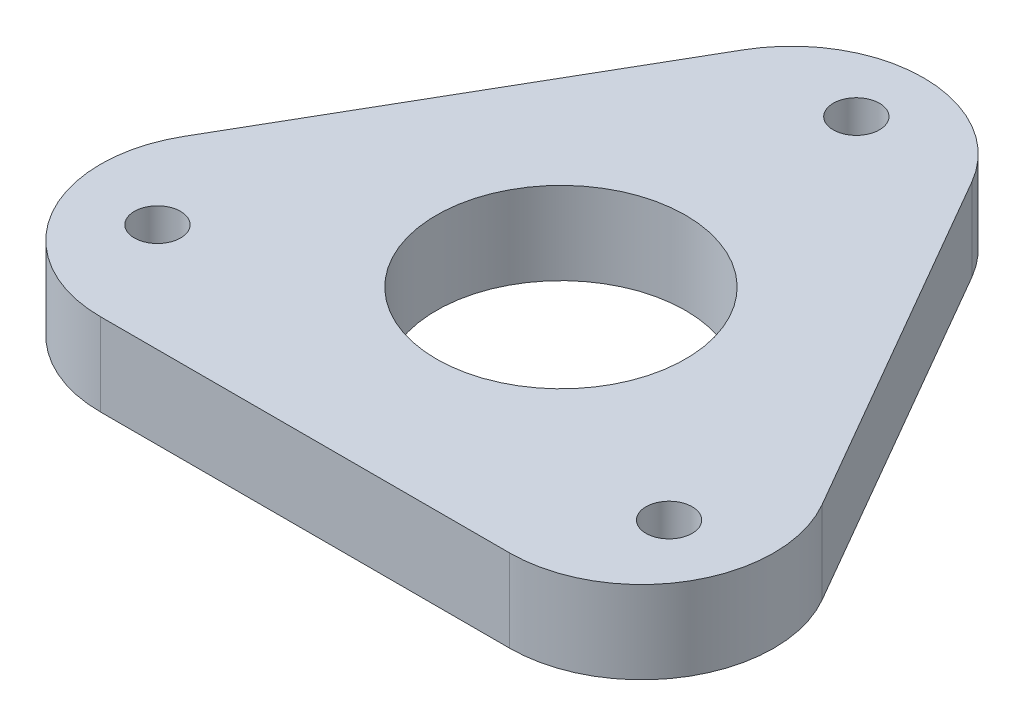
ISO-10303-21;
HEADER;
FILE_DESCRIPTION(('STEP AP214'),'2;1');
FILE_NAME('part.step','',(''),(''),'','','');
FILE_SCHEMA(('AUTOMOTIVE_DESIGN { 1 0 10303 214 1 1 1 1 }'));
ENDSEC;
DATA;
#1=APPLICATION_CONTEXT('core data for automotive mechanical design processes');
#2=APPLICATION_PROTOCOL_DEFINITION('international standard','automotive_design',2000,#1);
#3=PRODUCT_CONTEXT('',#1,'mechanical');
#4=PRODUCT('Part','Part','',(#3));
#5=PRODUCT_RELATED_PRODUCT_CATEGORY('part','',(#4));
#6=PRODUCT_DEFINITION_FORMATION('','',#4);
#7=PRODUCT_DEFINITION_CONTEXT('part definition',#1,'design');
#8=PRODUCT_DEFINITION('design','',#6,#7);
#9=PRODUCT_DEFINITION_SHAPE('','',#8);
#10=(LENGTH_UNIT() NAMED_UNIT(*) SI_UNIT(.MILLI.,.METRE.));
#11=(NAMED_UNIT(*) PLANE_ANGLE_UNIT() SI_UNIT($,.RADIAN.));
#12=(NAMED_UNIT(*) SI_UNIT($,.STERADIAN.) SOLID_ANGLE_UNIT());
#13=UNCERTAINTY_MEASURE_WITH_UNIT(LENGTH_MEASURE(1.E-05),#10,'distance_accuracy_value','');
#14=(GEOMETRIC_REPRESENTATION_CONTEXT(3) GLOBAL_UNCERTAINTY_ASSIGNED_CONTEXT((#13)) GLOBAL_UNIT_ASSIGNED_CONTEXT((#10,
#11,#12)) REPRESENTATION_CONTEXT('',''));
#15=CARTESIAN_POINT('',(0.,0.,0.));
#16=DIRECTION('',(0.,0.,1.));
#17=DIRECTION('',(1.,0.,0.));
#18=AXIS2_PLACEMENT_3D('',#15,#16,#17);
#19=CARTESIAN_POINT('',(32.0049681464521,25.,-65.104941493052));
#20=DIRECTION('',(0.,-1.,0.));
#21=DIRECTION('',(0.,0.,-1.));
#22=AXIS2_PLACEMENT_3D('',#19,#20,#21);
#23=CYLINDRICAL_SURFACE('',#22,40.);
#24=CARTESIAN_POINT('',(32.0049681464521,0.,-65.104941493052));
#25=DIRECTION('',(0.,1.,0.));
#26=DIRECTION('',(0.,0.,1.));
#27=AXIS2_PLACEMENT_3D('',#24,#25,#26);
#28=CIRCLE('',#27,40.);
#29=CARTESIAN_POINT('',(66.6459842978296,0.,-85.104941493052));
#30=VERTEX_POINT('',#29);
#31=CARTESIAN_POINT('',(-2.63604800492546,0.,-85.104941493052));
#32=VERTEX_POINT('',#31);
#33=EDGE_CURVE('E118',#30,#32,#28,.T.);
#34=ORIENTED_EDGE('',*,*,#33,.T.);
#35=DIRECTION('',(0.,-1.,0.));
#36=VECTOR('',#35,1.);
#37=CARTESIAN_POINT('',(-2.63604800492546,25.,-85.104941493052));
#38=LINE('',#37,#36);
#39=CARTESIAN_POINT('',(-2.63604800492546,25.,-85.104941493052));
#40=VERTEX_POINT('',#39);
#41=EDGE_CURVE('E11',#40,#32,#38,.T.);
#42=ORIENTED_EDGE('',*,*,#41,.F.);
#43=CARTESIAN_POINT('',(32.0049681464521,25.,-65.104941493052));
#44=DIRECTION('',(0.,1.,0.));
#45=DIRECTION('',(0.,0.,1.));
#46=AXIS2_PLACEMENT_3D('',#43,#44,#45);
#47=CIRCLE('',#46,40.);
#48=CARTESIAN_POINT('',(66.6459842978296,25.,-85.104941493052));
#49=VERTEX_POINT('',#48);
#50=EDGE_CURVE('E128',#49,#40,#47,.T.);
#51=ORIENTED_EDGE('',*,*,#50,.F.);
#52=DIRECTION('',(0.,-1.,0.));
#53=VECTOR('',#52,1.);
#54=CARTESIAN_POINT('',(66.6459842978296,25.,-85.104941493052));
#55=LINE('',#54,#53);
#56=EDGE_CURVE('E114',#49,#30,#55,.T.);
#57=ORIENTED_EDGE('',*,*,#56,.T.);
#58=EDGE_LOOP('',(#34,#42,#51,#57));
#59=FACE_BOUND('',#58,.T.);
#60=ADVANCED_FACE('F33',(#59),#23,.T.);
#61=CARTESIAN_POINT('',(-64.6340157021704,25.,22.2786885245903));
#62=DIRECTION('',(0.866025403784439,0.,0.5));
#63=DIRECTION('',(0.5,0.,-0.866025403784439));
#64=AXIS2_PLACEMENT_3D('',#61,#62,#63);
#65=PLANE('',#64);
#66=DIRECTION('',(-0.5,0.,0.866025403784439));
#67=VECTOR('',#66,1.);
#68=CARTESIAN_POINT('',(-64.6340157021704,0.,22.2786885245903));
#69=LINE('',#68,#67);
#70=CARTESIAN_POINT('',(-64.6340157021704,0.,22.2786885245903));
#71=VERTEX_POINT('',#70);
#72=EDGE_CURVE('E121',#32,#71,#69,.T.);
#73=ORIENTED_EDGE('',*,*,#72,.T.);
#74=DIRECTION('',(0.,-1.,0.));
#75=VECTOR('',#74,1.);
#76=CARTESIAN_POINT('',(-64.6340157021704,25.,22.2786885245903));
#77=LINE('',#76,#75);
#78=CARTESIAN_POINT('',(-64.6340157021704,25.,22.2786885245903));
#79=VERTEX_POINT('',#78);
#80=EDGE_CURVE('E42',#79,#71,#77,.T.);
#81=ORIENTED_EDGE('',*,*,#80,.F.);
#82=DIRECTION('',(-0.5,0.,0.866025403784439));
#83=VECTOR('',#82,1.);
#84=CARTESIAN_POINT('',(-64.6340157021704,25.,22.2786885245903));
#85=LINE('',#84,#83);
#86=EDGE_CURVE('E87',#40,#79,#85,.T.);
#87=ORIENTED_EDGE('',*,*,#86,.F.);
#88=ORIENTED_EDGE('',*,*,#41,.T.);
#89=EDGE_LOOP('',(#73,#81,#87,#88));
#90=FACE_BOUND('',#89,.T.);
#91=ADVANCED_FACE('F154',(#90),#65,.F.);
#92=CARTESIAN_POINT('',(-29.9929995507928,25.,42.2786885245903));
#93=DIRECTION('',(0.,-1.,0.));
#94=DIRECTION('',(0.,0.,-1.));
#95=AXIS2_PLACEMENT_3D('',#92,#93,#94);
#96=CYLINDRICAL_SURFACE('',#95,40.);
#97=CARTESIAN_POINT('',(-29.9929995507928,0.,42.2786885245903));
#98=DIRECTION('',(0.,1.,0.));
#99=DIRECTION('',(0.,0.,-1.));
#100=AXIS2_PLACEMENT_3D('',#97,#98,#99);
#101=CIRCLE('',#100,40.);
#102=CARTESIAN_POINT('',(-29.9929995507928,0.,82.2786885245903));
#103=VERTEX_POINT('',#102);
#104=EDGE_CURVE('E123',#71,#103,#101,.T.);
#105=ORIENTED_EDGE('',*,*,#104,.T.);
#106=DIRECTION('',(0.,-1.,0.));
#107=VECTOR('',#106,1.);
#108=CARTESIAN_POINT('',(-29.9929995507928,25.,82.2786885245903));
#109=LINE('',#108,#107);
#110=CARTESIAN_POINT('',(-29.9929995507928,25.,82.2786885245903));
#111=VERTEX_POINT('',#110);
#112=EDGE_CURVE('E109',#111,#103,#109,.T.);
#113=ORIENTED_EDGE('',*,*,#112,.F.);
#114=CARTESIAN_POINT('',(-29.9929995507928,25.,42.2786885245903));
#115=DIRECTION('',(0.,1.,0.));
#116=DIRECTION('',(0.,0.,-1.));
#117=AXIS2_PLACEMENT_3D('',#114,#115,#116);
#118=CIRCLE('',#117,40.);
#119=EDGE_CURVE('E100',#79,#111,#118,.T.);
#120=ORIENTED_EDGE('',*,*,#119,.F.);
#121=ORIENTED_EDGE('',*,*,#80,.T.);
#122=EDGE_LOOP('',(#105,#113,#120,#121));
#123=FACE_BOUND('',#122,.T.);
#124=ADVANCED_FACE('F135',(#123),#96,.T.);
#125=CARTESIAN_POINT('',(94.002935843697,25.,82.2786885245903));
#126=DIRECTION('',(0.,0.,-1.));
#127=DIRECTION('',(-1.,0.,0.));
#128=AXIS2_PLACEMENT_3D('',#125,#126,#127);
#129=PLANE('',#128);
#130=DIRECTION('',(1.,0.,0.));
#131=VECTOR('',#130,1.);
#132=CARTESIAN_POINT('',(94.002935843697,0.,82.2786885245903));
#133=LINE('',#132,#131);
#134=CARTESIAN_POINT('',(94.002935843697,0.,82.2786885245903));
#135=VERTEX_POINT('',#134);
#136=EDGE_CURVE('E108',#103,#135,#133,.T.);
#137=ORIENTED_EDGE('',*,*,#136,.T.);
#138=DIRECTION('',(0.,-1.,0.));
#139=VECTOR('',#138,1.);
#140=CARTESIAN_POINT('',(94.002935843697,25.,82.2786885245903));
#141=LINE('',#140,#139);
#142=CARTESIAN_POINT('',(94.002935843697,25.,82.2786885245903));
#143=VERTEX_POINT('',#142);
#144=EDGE_CURVE('E105',#143,#135,#141,.T.);
#145=ORIENTED_EDGE('',*,*,#144,.F.);
#146=DIRECTION('',(1.,0.,0.));
#147=VECTOR('',#146,1.);
#148=CARTESIAN_POINT('',(94.002935843697,25.,82.2786885245903));
#149=LINE('',#148,#147);
#150=EDGE_CURVE('E94',#111,#143,#149,.T.);
#151=ORIENTED_EDGE('',*,*,#150,.F.);
#152=ORIENTED_EDGE('',*,*,#112,.T.);
#153=EDGE_LOOP('',(#137,#145,#151,#152));
#154=FACE_BOUND('',#153,.T.);
#155=ADVANCED_FACE('F106',(#154),#129,.F.);
#156=CARTESIAN_POINT('',(94.002935843697,25.,42.2786885245902));
#157=DIRECTION('',(0.,-1.,0.));
#158=DIRECTION('',(0.,0.,-1.));
#159=AXIS2_PLACEMENT_3D('',#156,#157,#158);
#160=CYLINDRICAL_SURFACE('',#159,40.);
#161=CARTESIAN_POINT('',(94.002935843697,0.,42.2786885245902));
#162=DIRECTION('',(0.,1.,0.));
#163=DIRECTION('',(0.,0.,-1.));
#164=AXIS2_PLACEMENT_3D('',#161,#162,#163);
#165=CIRCLE('',#164,40.);
#166=CARTESIAN_POINT('',(128.643951995075,0.,22.2786885245902));
#167=VERTEX_POINT('',#166);
#168=EDGE_CURVE('E73',#135,#167,#165,.T.);
#169=ORIENTED_EDGE('',*,*,#168,.T.);
#170=DIRECTION('',(0.,-1.,0.));
#171=VECTOR('',#170,1.);
#172=CARTESIAN_POINT('',(128.643951995075,25.,22.2786885245902));
#173=LINE('',#172,#171);
#174=CARTESIAN_POINT('',(128.643951995075,25.,22.2786885245902));
#175=VERTEX_POINT('',#174);
#176=EDGE_CURVE('E110',#175,#167,#173,.T.);
#177=ORIENTED_EDGE('',*,*,#176,.F.);
#178=CARTESIAN_POINT('',(94.002935843697,25.,42.2786885245902));
#179=DIRECTION('',(0.,1.,0.));
#180=DIRECTION('',(0.,0.,-1.));
#181=AXIS2_PLACEMENT_3D('',#178,#179,#180);
#182=CIRCLE('',#181,40.);
#183=EDGE_CURVE('E98',#143,#175,#182,.T.);
#184=ORIENTED_EDGE('',*,*,#183,.F.);
#185=ORIENTED_EDGE('',*,*,#144,.T.);
#186=EDGE_LOOP('',(#169,#177,#184,#185));
#187=FACE_BOUND('',#186,.T.);
#188=ADVANCED_FACE('F112',(#187),#160,.T.);
#189=CARTESIAN_POINT('',(66.6459842978296,25.,-85.104941493052));
#190=DIRECTION('',(-0.866025403784438,0.,0.5));
#191=DIRECTION('',(0.5,0.,0.866025403784439));
#192=AXIS2_PLACEMENT_3D('',#189,#190,#191);
#193=PLANE('',#192);
#194=DIRECTION('',(-0.5,0.,-0.866025403784439));
#195=VECTOR('',#194,1.);
#196=CARTESIAN_POINT('',(66.6459842978296,0.,-85.104941493052));
#197=LINE('',#196,#195);
#198=EDGE_CURVE('E79',#167,#30,#197,.T.);
#199=ORIENTED_EDGE('',*,*,#198,.T.);
#200=ORIENTED_EDGE('',*,*,#56,.F.);
#201=DIRECTION('',(-0.5,0.,-0.866025403784439));
#202=VECTOR('',#201,1.);
#203=CARTESIAN_POINT('',(66.6459842978296,25.,-85.104941493052));
#204=LINE('',#203,#202);
#205=EDGE_CURVE('E50',#175,#49,#204,.T.);
#206=ORIENTED_EDGE('',*,*,#205,.F.);
#207=ORIENTED_EDGE('',*,*,#176,.T.);
#208=EDGE_LOOP('',(#199,#200,#206,#207));
#209=FACE_BOUND('',#208,.T.);
#210=ADVANCED_FACE('F142',(#209),#193,.F.);
#211=CARTESIAN_POINT('',(32.0049681464521,25.,-65.104941493052));
#212=DIRECTION('',(0.,1.,0.));
#213=DIRECTION('',(0.,0.,1.));
#214=AXIS2_PLACEMENT_3D('',#211,#212,#213);
#215=PLANE('',#214);
#216=CARTESIAN_POINT('',(32.0049681464521,25.,-84.7371973465846));
#217=DIRECTION('',(0.,1.,0.));
#218=DIRECTION('',(0.,0.,1.));
#219=AXIS2_PLACEMENT_3D('',#216,#217,#218);
#220=CIRCLE('',#219,7.);
#221=CARTESIAN_POINT('',(32.0049681464521,25.,-77.7371973465846));
#222=VERTEX_POINT('',#221);
#223=EDGE_CURVE('E240',#222,#222,#220,.T.);
#224=ORIENTED_EDGE('',*,*,#223,.F.);
#225=EDGE_LOOP('',(#224));
#226=FACE_BOUND('',#225,.T.);
#227=CARTESIAN_POINT('',(109.504968146452,25.,49.4967402400033));
#228=DIRECTION('',(0.,1.,0.));
#229=DIRECTION('',(0.,0.,1.));
#230=AXIS2_PLACEMENT_3D('',#227,#228,#229);
#231=CIRCLE('',#230,7.);
#232=CARTESIAN_POINT('',(109.504968146452,25.,56.4967402400033));
#233=VERTEX_POINT('',#232);
#234=EDGE_CURVE('E246',#233,#233,#231,.T.);
#235=ORIENTED_EDGE('',*,*,#234,.F.);
#236=EDGE_LOOP('',(#235));
#237=FACE_BOUND('',#236,.T.);
#238=CARTESIAN_POINT('',(-45.4950318535479,25.,49.4967402400033));
#239=DIRECTION('',(0.,1.,0.));
#240=DIRECTION('',(0.,0.,1.));
#241=AXIS2_PLACEMENT_3D('',#238,#239,#240);
#242=CIRCLE('',#241,7.);
#243=CARTESIAN_POINT('',(-45.4950318535479,25.,56.4967402400033));
#244=VERTEX_POINT('',#243);
#245=EDGE_CURVE('E254',#244,#244,#242,.T.);
#246=ORIENTED_EDGE('',*,*,#245,.F.);
#247=EDGE_LOOP('',(#246));
#248=FACE_BOUND('',#247,.T.);
#249=CARTESIAN_POINT('',(32.0049681464521,25.,4.75209437780733));
#250=DIRECTION('',(0.,1.,0.));
#251=DIRECTION('',(0.,0.,1.));
#252=AXIS2_PLACEMENT_3D('',#249,#250,#251);
#253=CIRCLE('',#252,37.75);
#254=CARTESIAN_POINT('',(32.0049681464521,25.,42.5020943778073));
#255=VERTEX_POINT('',#254);
#256=EDGE_CURVE('E243',#255,#255,#253,.T.);
#257=ORIENTED_EDGE('',*,*,#256,.F.);
#258=EDGE_LOOP('',(#257));
#259=FACE_BOUND('',#258,.T.);
#260=ORIENTED_EDGE('',*,*,#50,.T.);
#261=ORIENTED_EDGE('',*,*,#86,.T.);
#262=ORIENTED_EDGE('',*,*,#119,.T.);
#263=ORIENTED_EDGE('',*,*,#150,.T.);
#264=ORIENTED_EDGE('',*,*,#183,.T.);
#265=ORIENTED_EDGE('',*,*,#205,.T.);
#266=EDGE_LOOP('',(#260,#261,#262,#263,#264,#265));
#267=FACE_BOUND('',#266,.T.);
#268=ADVANCED_FACE('F96',(#226,#237,#248,#259,#267),#215,.T.);
#269=CARTESIAN_POINT('',(32.0049681464521,0.,-65.104941493052));
#270=DIRECTION('',(0.,1.,0.));
#271=DIRECTION('',(0.,0.,1.));
#272=AXIS2_PLACEMENT_3D('',#269,#270,#271);
#273=PLANE('',#272);
#274=CARTESIAN_POINT('',(32.0049681464521,0.,-84.7371973465846));
#275=DIRECTION('',(0.,1.,0.));
#276=DIRECTION('',(0.,0.,1.));
#277=AXIS2_PLACEMENT_3D('',#274,#275,#276);
#278=CIRCLE('',#277,7.);
#279=CARTESIAN_POINT('',(32.0049681464521,0.,-77.7371973465846));
#280=VERTEX_POINT('',#279);
#281=EDGE_CURVE('E237',#280,#280,#278,.T.);
#282=ORIENTED_EDGE('',*,*,#281,.T.);
#283=EDGE_LOOP('',(#282));
#284=FACE_BOUND('',#283,.T.);
#285=CARTESIAN_POINT('',(109.504968146452,0.,49.4967402400033));
#286=DIRECTION('',(0.,1.,0.));
#287=DIRECTION('',(0.,0.,1.));
#288=AXIS2_PLACEMENT_3D('',#285,#286,#287);
#289=CIRCLE('',#288,7.);
#290=CARTESIAN_POINT('',(109.504968146452,0.,56.4967402400033));
#291=VERTEX_POINT('',#290);
#292=EDGE_CURVE('E241',#291,#291,#289,.T.);
#293=ORIENTED_EDGE('',*,*,#292,.T.);
#294=EDGE_LOOP('',(#293));
#295=FACE_BOUND('',#294,.T.);
#296=CARTESIAN_POINT('',(-45.4950318535479,0.,49.4967402400033));
#297=DIRECTION('',(0.,1.,0.));
#298=DIRECTION('',(0.,0.,1.));
#299=AXIS2_PLACEMENT_3D('',#296,#297,#298);
#300=CIRCLE('',#299,7.);
#301=CARTESIAN_POINT('',(-45.4950318535479,0.,56.4967402400033));
#302=VERTEX_POINT('',#301);
#303=EDGE_CURVE('E251',#302,#302,#300,.T.);
#304=ORIENTED_EDGE('',*,*,#303,.T.);
#305=EDGE_LOOP('',(#304));
#306=FACE_BOUND('',#305,.T.);
#307=CARTESIAN_POINT('',(32.0049681464521,0.,4.75209437780733));
#308=DIRECTION('',(0.,1.,0.));
#309=DIRECTION('',(0.,0.,1.));
#310=AXIS2_PLACEMENT_3D('',#307,#308,#309);
#311=CIRCLE('',#310,37.75);
#312=CARTESIAN_POINT('',(32.0049681464521,0.,42.5020943778073));
#313=VERTEX_POINT('',#312);
#314=EDGE_CURVE('E36',#313,#313,#311,.T.);
#315=ORIENTED_EDGE('',*,*,#314,.T.);
#316=EDGE_LOOP('',(#315));
#317=FACE_BOUND('',#316,.T.);
#318=ORIENTED_EDGE('',*,*,#33,.F.);
#319=ORIENTED_EDGE('',*,*,#198,.F.);
#320=ORIENTED_EDGE('',*,*,#168,.F.);
#321=ORIENTED_EDGE('',*,*,#136,.F.);
#322=ORIENTED_EDGE('',*,*,#104,.F.);
#323=ORIENTED_EDGE('',*,*,#72,.F.);
#324=EDGE_LOOP('',(#318,#319,#320,#321,#322,#323));
#325=FACE_BOUND('',#324,.T.);
#326=ADVANCED_FACE('F138',(#284,#295,#306,#317,#325),#273,.F.);
#327=CARTESIAN_POINT('',(32.0049681464521,-3.,4.75209437780733));
#328=DIRECTION('',(0.,1.,0.));
#329=DIRECTION('',(0.,0.,1.));
#330=AXIS2_PLACEMENT_3D('',#327,#328,#329);
#331=CYLINDRICAL_SURFACE('',#330,37.75);
#332=ORIENTED_EDGE('',*,*,#256,.T.);
#333=EDGE_LOOP('',(#332));
#334=FACE_BOUND('',#333,.T.);
#335=ORIENTED_EDGE('',*,*,#314,.F.);
#336=EDGE_LOOP('',(#335));
#337=FACE_BOUND('',#336,.T.);
#338=ADVANCED_FACE('F182',(#334,#337),#331,.F.);
#339=CARTESIAN_POINT('',(-45.4950318535479,0.,49.4967402400033));
#340=DIRECTION('',(0.,1.,0.));
#341=DIRECTION('',(0.,0.,1.));
#342=AXIS2_PLACEMENT_3D('',#339,#340,#341);
#343=CYLINDRICAL_SURFACE('',#342,7.);
#344=ORIENTED_EDGE('',*,*,#303,.F.);
#345=EDGE_LOOP('',(#344));
#346=FACE_BOUND('',#345,.T.);
#347=ORIENTED_EDGE('',*,*,#245,.T.);
#348=EDGE_LOOP('',(#347));
#349=FACE_BOUND('',#348,.T.);
#350=ADVANCED_FACE('F187',(#346,#349),#343,.F.);
#351=CARTESIAN_POINT('',(109.504968146452,0.,49.4967402400033));
#352=DIRECTION('',(0.,1.,0.));
#353=DIRECTION('',(0.,0.,1.));
#354=AXIS2_PLACEMENT_3D('',#351,#352,#353);
#355=CYLINDRICAL_SURFACE('',#354,7.);
#356=ORIENTED_EDGE('',*,*,#292,.F.);
#357=EDGE_LOOP('',(#356));
#358=FACE_BOUND('',#357,.T.);
#359=ORIENTED_EDGE('',*,*,#234,.T.);
#360=EDGE_LOOP('',(#359));
#361=FACE_BOUND('',#360,.T.);
#362=ADVANCED_FACE('F210',(#358,#361),#355,.F.);
#363=CARTESIAN_POINT('',(32.0049681464521,0.,-84.7371973465846));
#364=DIRECTION('',(0.,1.,0.));
#365=DIRECTION('',(0.,0.,1.));
#366=AXIS2_PLACEMENT_3D('',#363,#364,#365);
#367=CYLINDRICAL_SURFACE('',#366,7.);
#368=ORIENTED_EDGE('',*,*,#281,.F.);
#369=EDGE_LOOP('',(#368));
#370=FACE_BOUND('',#369,.T.);
#371=ORIENTED_EDGE('',*,*,#223,.T.);
#372=EDGE_LOOP('',(#371));
#373=FACE_BOUND('',#372,.T.);
#374=ADVANCED_FACE('F220',(#370,#373),#367,.F.);
#375=CLOSED_SHELL('',(#60,#91,#124,#155,#188,#210,#268,#326,#338,#350,#362,#374));
#376=MANIFOLD_SOLID_BREP('B2',#375);
#377=ADVANCED_BREP_SHAPE_REPRESENTATION('',(#18,#376),#14);
#378=SHAPE_DEFINITION_REPRESENTATION(#9,#377);
ENDSEC;
END-ISO-10303-21;
